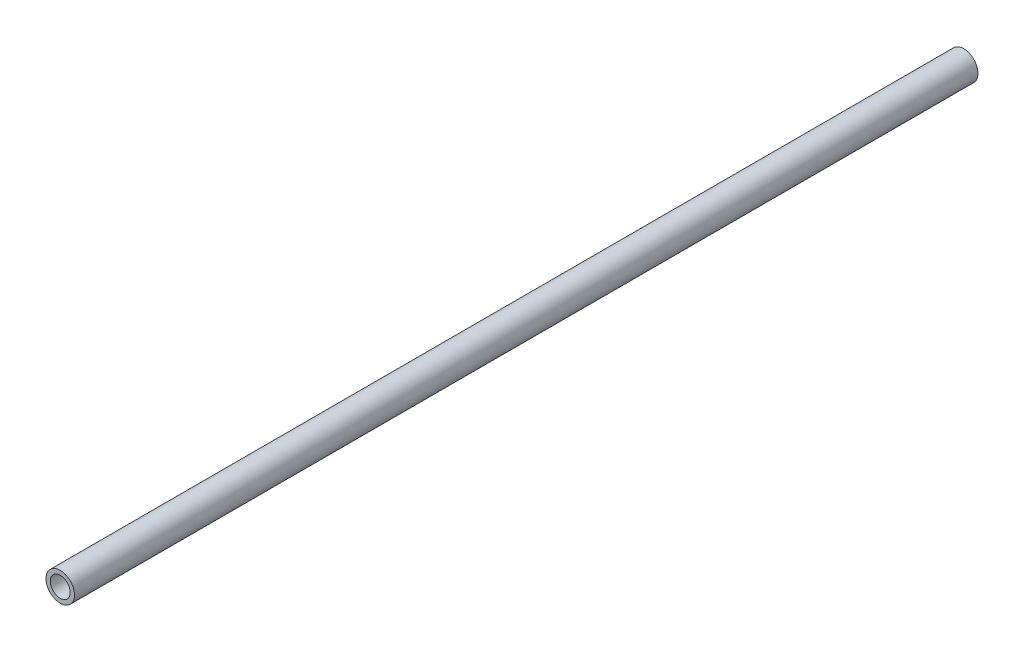
ISO-10303-21;
HEADER;
FILE_DESCRIPTION(('STEP AP214'),'2;1');
FILE_NAME('part.step','',(''),(''),'','','');
FILE_SCHEMA(('AUTOMOTIVE_DESIGN { 1 0 10303 214 1 1 1 1 }'));
ENDSEC;
DATA;
#1=APPLICATION_CONTEXT('core data for automotive mechanical design processes');
#2=APPLICATION_PROTOCOL_DEFINITION('international standard','automotive_design',2000,#1);
#3=PRODUCT_CONTEXT('',#1,'mechanical');
#4=PRODUCT('Part','Part','',(#3));
#5=PRODUCT_RELATED_PRODUCT_CATEGORY('part','',(#4));
#6=PRODUCT_DEFINITION_FORMATION('','',#4);
#7=PRODUCT_DEFINITION_CONTEXT('part definition',#1,'design');
#8=PRODUCT_DEFINITION('design','',#6,#7);
#9=PRODUCT_DEFINITION_SHAPE('','',#8);
#10=(LENGTH_UNIT() NAMED_UNIT(*) SI_UNIT(.MILLI.,.METRE.));
#11=(NAMED_UNIT(*) PLANE_ANGLE_UNIT() SI_UNIT($,.RADIAN.));
#12=(NAMED_UNIT(*) SI_UNIT($,.STERADIAN.) SOLID_ANGLE_UNIT());
#13=UNCERTAINTY_MEASURE_WITH_UNIT(LENGTH_MEASURE(1.E-05),#10,'distance_accuracy_value','');
#14=(GEOMETRIC_REPRESENTATION_CONTEXT(3) GLOBAL_UNCERTAINTY_ASSIGNED_CONTEXT((#13)) GLOBAL_UNIT_ASSIGNED_CONTEXT((#10,
#11,#12)) REPRESENTATION_CONTEXT('',''));
#15=CARTESIAN_POINT('',(0.,0.,0.));
#16=DIRECTION('',(0.,0.,1.));
#17=DIRECTION('',(1.,0.,0.));
#18=AXIS2_PLACEMENT_3D('',#15,#16,#17);
#19=CARTESIAN_POINT('',(0.,0.,-241.3));
#20=DIRECTION('',(0.,0.,1.));
#21=DIRECTION('',(1.,0.,0.));
#22=AXIS2_PLACEMENT_3D('',#19,#20,#21);
#23=CYLINDRICAL_SURFACE('',#22,3.81);
#24=CARTESIAN_POINT('',(0.,0.,-241.3));
#25=DIRECTION('',(0.,0.,1.));
#26=DIRECTION('',(1.,0.,0.));
#27=AXIS2_PLACEMENT_3D('',#24,#25,#26);
#28=CIRCLE('',#27,3.81);
#29=CARTESIAN_POINT('',(3.81,0.,-241.3));
#30=VERTEX_POINT('',#29);
#31=EDGE_CURVE('E10',#30,#30,#28,.T.);
#32=CARTESIAN_POINT('',(0.,0.,0.));
#33=DIRECTION('',(0.,0.,1.));
#34=DIRECTION('',(1.,0.,0.));
#35=AXIS2_PLACEMENT_3D('',#32,#33,#34);
#36=CIRCLE('',#35,3.81);
#37=CARTESIAN_POINT('',(3.81,0.,0.));
#38=VERTEX_POINT('',#37);
#39=EDGE_CURVE('E36',#38,#38,#36,.T.);
#40=CARTESIAN_POINT('',(3.81,0.,-241.3));
#41=CARTESIAN_POINT('',(3.81,0.,-238.786458333333));
#42=CARTESIAN_POINT('',(3.81,0.,-236.272916666667));
#43=CARTESIAN_POINT('',(3.81,0.,-231.245833333333));
#44=CARTESIAN_POINT('',(3.81,0.,-228.732291666667));
#45=CARTESIAN_POINT('',(3.81,0.,-223.705208333333));
#46=CARTESIAN_POINT('',(3.81,0.,-221.191666666667));
#47=CARTESIAN_POINT('',(3.81,0.,-216.164583333333));
#48=CARTESIAN_POINT('',(3.81,0.,-213.651041666667));
#49=CARTESIAN_POINT('',(3.81,0.,-208.623958333333));
#50=CARTESIAN_POINT('',(3.81,0.,-206.110416666667));
#51=CARTESIAN_POINT('',(3.81,0.,-201.083333333333));
#52=CARTESIAN_POINT('',(3.81,0.,-198.569791666667));
#53=CARTESIAN_POINT('',(3.81,0.,-193.542708333333));
#54=CARTESIAN_POINT('',(3.81,0.,-191.029166666667));
#55=CARTESIAN_POINT('',(3.81,0.,-186.002083333333));
#56=CARTESIAN_POINT('',(3.81,0.,-183.488541666667));
#57=CARTESIAN_POINT('',(3.81,0.,-178.461458333333));
#58=CARTESIAN_POINT('',(3.81,0.,-175.947916666667));
#59=CARTESIAN_POINT('',(3.81,0.,-170.920833333333));
#60=CARTESIAN_POINT('',(3.81,0.,-168.407291666667));
#61=CARTESIAN_POINT('',(3.81,0.,-163.380208333333));
#62=CARTESIAN_POINT('',(3.81,0.,-160.866666666667));
#63=CARTESIAN_POINT('',(3.81,0.,-155.839583333333));
#64=CARTESIAN_POINT('',(3.81,0.,-153.326041666667));
#65=CARTESIAN_POINT('',(3.81,0.,-148.298958333333));
#66=CARTESIAN_POINT('',(3.81,0.,-145.785416666667));
#67=CARTESIAN_POINT('',(3.81,0.,-140.758333333333));
#68=CARTESIAN_POINT('',(3.81,0.,-138.244791666667));
#69=CARTESIAN_POINT('',(3.81,0.,-133.217708333333));
#70=CARTESIAN_POINT('',(3.81,0.,-130.704166666667));
#71=CARTESIAN_POINT('',(3.81,0.,-125.677083333333));
#72=CARTESIAN_POINT('',(3.81,0.,-123.163541666667));
#73=CARTESIAN_POINT('',(3.81,0.,-118.136458333333));
#74=CARTESIAN_POINT('',(3.81,0.,-115.622916666667));
#75=CARTESIAN_POINT('',(3.81,0.,-110.595833333333));
#76=CARTESIAN_POINT('',(3.81,0.,-108.082291666667));
#77=CARTESIAN_POINT('',(3.81,0.,-103.055208333333));
#78=CARTESIAN_POINT('',(3.81,0.,-100.541666666667));
#79=CARTESIAN_POINT('',(3.81,0.,-95.5145833333334));
#80=CARTESIAN_POINT('',(3.81,0.,-93.0010416666667));
#81=CARTESIAN_POINT('',(3.81,0.,-87.9739583333334));
#82=CARTESIAN_POINT('',(3.81,0.,-85.4604166666667));
#83=CARTESIAN_POINT('',(3.81,0.,-80.4333333333333));
#84=CARTESIAN_POINT('',(3.81,0.,-77.9197916666667));
#85=CARTESIAN_POINT('',(3.81,0.,-72.8927083333333));
#86=CARTESIAN_POINT('',(3.81,0.,-70.3791666666667));
#87=CARTESIAN_POINT('',(3.81,0.,-65.3520833333334));
#88=CARTESIAN_POINT('',(3.81,0.,-62.8385416666667));
#89=CARTESIAN_POINT('',(3.81,0.,-57.8114583333333));
#90=CARTESIAN_POINT('',(3.81,0.,-55.2979166666667));
#91=CARTESIAN_POINT('',(3.81,0.,-50.2708333333333));
#92=CARTESIAN_POINT('',(3.81,0.,-47.7572916666667));
#93=CARTESIAN_POINT('',(3.81,0.,-42.7302083333333));
#94=CARTESIAN_POINT('',(3.81,0.,-40.2166666666667));
#95=CARTESIAN_POINT('',(3.81,0.,-35.1895833333333));
#96=CARTESIAN_POINT('',(3.81,0.,-32.6760416666667));
#97=CARTESIAN_POINT('',(3.81,0.,-27.6489583333333));
#98=CARTESIAN_POINT('',(3.81,0.,-25.1354166666667));
#99=CARTESIAN_POINT('',(3.81,0.,-20.1083333333333));
#100=CARTESIAN_POINT('',(3.81,0.,-17.5947916666667));
#101=CARTESIAN_POINT('',(3.81,0.,-12.5677083333333));
#102=CARTESIAN_POINT('',(3.81,0.,-10.0541666666667));
#103=CARTESIAN_POINT('',(3.81,0.,-5.02708333333333));
#104=CARTESIAN_POINT('',(3.81,0.,-2.51354166666666));
#105=CARTESIAN_POINT('',(3.81,0.,0.));
#106=B_SPLINE_CURVE_WITH_KNOTS('',3,(#40,#41,#42,#43,#44,#45,#46,#47,#48,#49,#50,#51,#52,#53,
#54,#55,#56,#57,#58,#59,#60,#61,#62,#63,#64,#65,#66,#67,#68,#69,#70,#71,#72,#73,#74,#75,#76,#77,
#78,#79,#80,#81,#82,#83,#84,#85,#86,#87,#88,#89,#90,#91,#92,#93,#94,#95,#96,#97,#98,#99,#100,
#101,#102,#103,#104,#105),.UNSPECIFIED.,.F.,.F.,(4,2,2,2,2,2,2,2,2,2,2,2,2,2,2,2,2,2,2,2,2,2,2,
2,2,2,2,2,2,2,2,2,4),(0.,7.54062500000002,15.08125,22.621875,30.1625,37.703125,45.24375,
52.784375,60.325,67.865625,75.40625,82.946875,90.4875,98.028125,105.56875,113.109375,120.65,
128.190625,135.73125,143.271875,150.8125,158.353125,165.89375,173.434375,180.975,188.515625,
196.05625,203.596875,211.1375,218.678125,226.21875,233.759375,241.3),.UNSPECIFIED.);
#107=EDGE_CURVE('BSEAM33',#30,#38,#106,.T.);
#108=ORIENTED_EDGE('',*,*,#31,.T.);
#109=ORIENTED_EDGE('',*,*,#39,.F.);
#110=ORIENTED_EDGE('',*,*,#107,.T.);
#111=ORIENTED_EDGE('',*,*,#107,.F.);
#112=EDGE_LOOP('',(#108,#110,#109,#111));
#113=FACE_BOUND('',#112,.T.);
#114=ADVANCED_FACE('F33',(#113),#23,.T.);
#115=CARTESIAN_POINT('',(0.,0.,-241.3));
#116=DIRECTION('',(0.,0.,1.));
#117=DIRECTION('',(1.,0.,0.));
#118=AXIS2_PLACEMENT_3D('',#115,#116,#117);
#119=PLANE('',#118);
#120=CARTESIAN_POINT('',(0.,0.,-241.3));
#121=DIRECTION('',(0.,0.,1.));
#122=DIRECTION('',(1.,0.,0.));
#123=AXIS2_PLACEMENT_3D('',#120,#121,#122);
#124=CIRCLE('',#123,2.667);
#125=CARTESIAN_POINT('',(2.667,0.,-241.3));
#126=VERTEX_POINT('',#125);
#127=EDGE_CURVE('E43',#126,#126,#124,.T.);
#128=ORIENTED_EDGE('',*,*,#127,.T.);
#129=EDGE_LOOP('',(#128));
#130=FACE_BOUND('',#129,.T.);
#131=ORIENTED_EDGE('',*,*,#31,.F.);
#132=EDGE_LOOP('',(#131));
#133=FACE_BOUND('',#132,.T.);
#134=ADVANCED_FACE('F51',(#130,#133),#119,.F.);
#135=CARTESIAN_POINT('',(0.,0.,0.));
#136=DIRECTION('',(0.,0.,1.));
#137=DIRECTION('',(1.,0.,0.));
#138=AXIS2_PLACEMENT_3D('',#135,#136,#137);
#139=PLANE('',#138);
#140=CARTESIAN_POINT('',(0.,0.,0.));
#141=DIRECTION('',(0.,0.,1.));
#142=DIRECTION('',(1.,0.,0.));
#143=AXIS2_PLACEMENT_3D('',#140,#141,#142);
#144=CIRCLE('',#143,2.667);
#145=CARTESIAN_POINT('',(2.667,0.,0.));
#146=VERTEX_POINT('',#145);
#147=EDGE_CURVE('E45',#146,#146,#144,.T.);
#148=ORIENTED_EDGE('',*,*,#147,.F.);
#149=EDGE_LOOP('',(#148));
#150=FACE_BOUND('',#149,.T.);
#151=ORIENTED_EDGE('',*,*,#39,.T.);
#152=EDGE_LOOP('',(#151));
#153=FACE_BOUND('',#152,.T.);
#154=ADVANCED_FACE('F57',(#150,#153),#139,.T.);
#155=CARTESIAN_POINT('',(0.,0.,-241.3));
#156=DIRECTION('',(0.,0.,1.));
#157=DIRECTION('',(1.,0.,0.));
#158=AXIS2_PLACEMENT_3D('',#155,#156,#157);
#159=CYLINDRICAL_SURFACE('',#158,2.667);
#160=CARTESIAN_POINT('',(2.667,0.,-241.3));
#161=CARTESIAN_POINT('',(2.667,0.,-238.786458333333));
#162=CARTESIAN_POINT('',(2.667,0.,-236.272916666667));
#163=CARTESIAN_POINT('',(2.667,0.,-231.245833333333));
#164=CARTESIAN_POINT('',(2.667,0.,-228.732291666667));
#165=CARTESIAN_POINT('',(2.667,0.,-223.705208333333));
#166=CARTESIAN_POINT('',(2.667,0.,-221.191666666667));
#167=CARTESIAN_POINT('',(2.667,0.,-216.164583333333));
#168=CARTESIAN_POINT('',(2.667,0.,-213.651041666667));
#169=CARTESIAN_POINT('',(2.667,0.,-208.623958333333));
#170=CARTESIAN_POINT('',(2.667,0.,-206.110416666667));
#171=CARTESIAN_POINT('',(2.667,0.,-201.083333333333));
#172=CARTESIAN_POINT('',(2.667,0.,-198.569791666667));
#173=CARTESIAN_POINT('',(2.667,0.,-193.542708333333));
#174=CARTESIAN_POINT('',(2.667,0.,-191.029166666667));
#175=CARTESIAN_POINT('',(2.667,0.,-186.002083333333));
#176=CARTESIAN_POINT('',(2.667,0.,-183.488541666667));
#177=CARTESIAN_POINT('',(2.667,0.,-178.461458333333));
#178=CARTESIAN_POINT('',(2.667,0.,-175.947916666667));
#179=CARTESIAN_POINT('',(2.667,0.,-170.920833333333));
#180=CARTESIAN_POINT('',(2.667,0.,-168.407291666667));
#181=CARTESIAN_POINT('',(2.667,0.,-163.380208333333));
#182=CARTESIAN_POINT('',(2.667,0.,-160.866666666667));
#183=CARTESIAN_POINT('',(2.667,0.,-155.839583333333));
#184=CARTESIAN_POINT('',(2.667,0.,-153.326041666667));
#185=CARTESIAN_POINT('',(2.667,0.,-148.298958333333));
#186=CARTESIAN_POINT('',(2.667,0.,-145.785416666667));
#187=CARTESIAN_POINT('',(2.667,0.,-140.758333333333));
#188=CARTESIAN_POINT('',(2.667,0.,-138.244791666667));
#189=CARTESIAN_POINT('',(2.667,0.,-133.217708333333));
#190=CARTESIAN_POINT('',(2.667,0.,-130.704166666667));
#191=CARTESIAN_POINT('',(2.667,0.,-125.677083333333));
#192=CARTESIAN_POINT('',(2.667,0.,-123.163541666667));
#193=CARTESIAN_POINT('',(2.667,0.,-118.136458333333));
#194=CARTESIAN_POINT('',(2.667,0.,-115.622916666667));
#195=CARTESIAN_POINT('',(2.667,0.,-110.595833333333));
#196=CARTESIAN_POINT('',(2.667,0.,-108.082291666667));
#197=CARTESIAN_POINT('',(2.667,0.,-103.055208333333));
#198=CARTESIAN_POINT('',(2.667,0.,-100.541666666667));
#199=CARTESIAN_POINT('',(2.667,0.,-95.5145833333333));
#200=CARTESIAN_POINT('',(2.667,0.,-93.0010416666667));
#201=CARTESIAN_POINT('',(2.667,0.,-87.9739583333333));
#202=CARTESIAN_POINT('',(2.667,0.,-85.4604166666667));
#203=CARTESIAN_POINT('',(2.667,0.,-80.4333333333333));
#204=CARTESIAN_POINT('',(2.667,0.,-77.9197916666667));
#205=CARTESIAN_POINT('',(2.667,0.,-72.8927083333333));
#206=CARTESIAN_POINT('',(2.667,0.,-70.3791666666667));
#207=CARTESIAN_POINT('',(2.667,0.,-65.3520833333334));
#208=CARTESIAN_POINT('',(2.667,0.,-62.8385416666667));
#209=CARTESIAN_POINT('',(2.667,0.,-57.8114583333333));
#210=CARTESIAN_POINT('',(2.667,0.,-55.2979166666667));
#211=CARTESIAN_POINT('',(2.667,0.,-50.2708333333333));
#212=CARTESIAN_POINT('',(2.667,0.,-47.7572916666667));
#213=CARTESIAN_POINT('',(2.667,0.,-42.7302083333333));
#214=CARTESIAN_POINT('',(2.667,0.,-40.2166666666667));
#215=CARTESIAN_POINT('',(2.667,0.,-35.1895833333333));
#216=CARTESIAN_POINT('',(2.667,0.,-32.6760416666667));
#217=CARTESIAN_POINT('',(2.667,0.,-27.6489583333333));
#218=CARTESIAN_POINT('',(2.667,0.,-25.1354166666667));
#219=CARTESIAN_POINT('',(2.667,0.,-20.1083333333333));
#220=CARTESIAN_POINT('',(2.667,0.,-17.5947916666667));
#221=CARTESIAN_POINT('',(2.667,0.,-12.5677083333333));
#222=CARTESIAN_POINT('',(2.667,0.,-10.0541666666667));
#223=CARTESIAN_POINT('',(2.667,0.,-5.02708333333333));
#224=CARTESIAN_POINT('',(2.667,0.,-2.51354166666666));
#225=CARTESIAN_POINT('',(2.667,0.,0.));
#226=B_SPLINE_CURVE_WITH_KNOTS('',3,(#160,#161,#162,#163,#164,#165,#166,#167,#168,#169,#170,
#171,#172,#173,#174,#175,#176,#177,#178,#179,#180,#181,#182,#183,#184,#185,#186,#187,#188,#189,
#190,#191,#192,#193,#194,#195,#196,#197,#198,#199,#200,#201,#202,#203,#204,#205,#206,#207,#208,
#209,#210,#211,#212,#213,#214,#215,#216,#217,#218,#219,#220,#221,#222,#223,#224,#225),
.UNSPECIFIED.,.F.,.F.,(4,2,2,2,2,2,2,2,2,2,2,2,2,2,2,2,2,2,2,2,2,2,2,2,2,2,2,2,2,2,2,2,4),(0.,
7.540625,15.08125,22.621875,30.1625,37.703125,45.24375,52.784375,60.325,67.865625,75.40625,
82.946875,90.4875,98.028125,105.56875,113.109375,120.65,128.190625,135.73125,143.271875,
150.8125,158.353125,165.89375,173.434375,180.975,188.515625,196.05625,203.596875,211.1375,
218.678125,226.21875,233.759375,241.3),.UNSPECIFIED.);
#227=EDGE_CURVE('BSEAM54',#126,#146,#226,.T.);
#228=ORIENTED_EDGE('',*,*,#127,.F.);
#229=ORIENTED_EDGE('',*,*,#147,.T.);
#230=ORIENTED_EDGE('',*,*,#227,.T.);
#231=ORIENTED_EDGE('',*,*,#227,.F.);
#232=EDGE_LOOP('',(#228,#230,#229,#231));
#233=FACE_BOUND('',#232,.T.);
#234=ADVANCED_FACE('F54',(#233),#159,.F.);
#235=CLOSED_SHELL('',(#114,#134,#154,#234));
#236=MANIFOLD_SOLID_BREP('B2',#235);
#237=ADVANCED_BREP_SHAPE_REPRESENTATION('',(#18,#236),#14);
#238=SHAPE_DEFINITION_REPRESENTATION(#9,#237);
ENDSEC;
END-ISO-10303-21;
